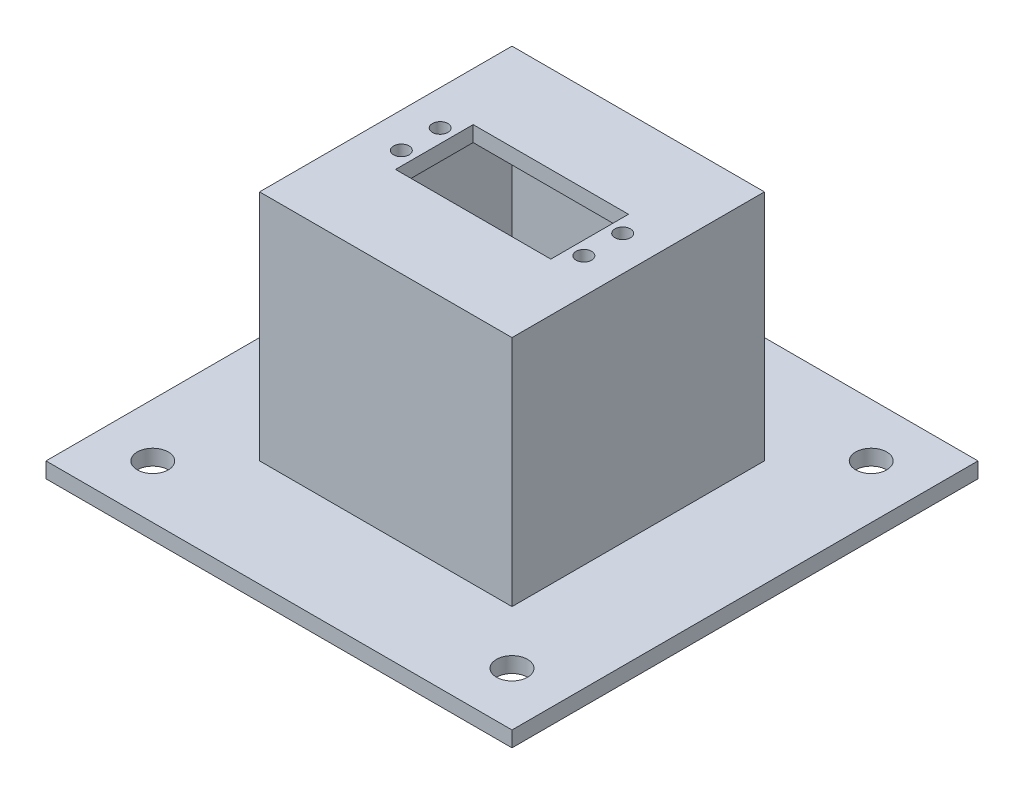
ISO-10303-21;
HEADER;
FILE_DESCRIPTION(('STEP AP214'),'2;1');
FILE_NAME('part.step','',(''),(''),'','','');
FILE_SCHEMA(('AUTOMOTIVE_DESIGN { 1 0 10303 214 1 1 1 1 }'));
ENDSEC;
DATA;
#1=APPLICATION_CONTEXT('core data for automotive mechanical design processes');
#2=APPLICATION_PROTOCOL_DEFINITION('international standard','automotive_design',2000,#1);
#3=PRODUCT_CONTEXT('',#1,'mechanical');
#4=PRODUCT('Part','Part','',(#3));
#5=PRODUCT_RELATED_PRODUCT_CATEGORY('part','',(#4));
#6=PRODUCT_DEFINITION_FORMATION('','',#4);
#7=PRODUCT_DEFINITION_CONTEXT('part definition',#1,'design');
#8=PRODUCT_DEFINITION('design','',#6,#7);
#9=PRODUCT_DEFINITION_SHAPE('','',#8);
#10=(LENGTH_UNIT() NAMED_UNIT(*) SI_UNIT(.MILLI.,.METRE.));
#11=(NAMED_UNIT(*) PLANE_ANGLE_UNIT() SI_UNIT($,.RADIAN.));
#12=(NAMED_UNIT(*) SI_UNIT($,.STERADIAN.) SOLID_ANGLE_UNIT());
#13=UNCERTAINTY_MEASURE_WITH_UNIT(LENGTH_MEASURE(1.E-05),#10,'distance_accuracy_value','');
#14=(GEOMETRIC_REPRESENTATION_CONTEXT(3) GLOBAL_UNCERTAINTY_ASSIGNED_CONTEXT((#13)) GLOBAL_UNIT_ASSIGNED_CONTEXT((#10,
#11,#12)) REPRESENTATION_CONTEXT('',''));
#15=CARTESIAN_POINT('',(0.,0.,0.));
#16=DIRECTION('',(0.,0.,1.));
#17=DIRECTION('',(1.,0.,0.));
#18=AXIS2_PLACEMENT_3D('',#15,#16,#17);
#19=CARTESIAN_POINT('',(0.,-4.,0.));
#20=DIRECTION('',(0.,-1.,0.));
#21=DIRECTION('',(0.,0.,-1.));
#22=AXIS2_PLACEMENT_3D('',#19,#20,#21);
#23=PLANE('',#22);
#24=CARTESIAN_POINT('',(-78.75,-4.,13.75));
#25=DIRECTION('',(0.,-1.,0.));
#26=DIRECTION('',(0.,0.,-1.));
#27=AXIS2_PLACEMENT_3D('',#24,#25,#26);
#28=CIRCLE('',#27,4.00000000000001);
#29=CARTESIAN_POINT('',(-78.75,-4.,9.75000000000002));
#30=VERTEX_POINT('',#29);
#31=EDGE_CURVE('E246',#30,#30,#28,.F.);
#32=ORIENTED_EDGE('',*,*,#31,.T.);
#33=EDGE_LOOP('',(#32));
#34=FACE_BOUND('',#33,.T.);
#35=CARTESIAN_POINT('',(13.75,-4.,13.75));
#36=DIRECTION('',(0.,-1.,0.));
#37=DIRECTION('',(0.,0.,-1.));
#38=AXIS2_PLACEMENT_3D('',#35,#36,#37);
#39=CIRCLE('',#38,4.00000000000001);
#40=CARTESIAN_POINT('',(13.75,-4.,9.75000000000002));
#41=VERTEX_POINT('',#40);
#42=EDGE_CURVE('E258',#41,#41,#39,.F.);
#43=ORIENTED_EDGE('',*,*,#42,.T.);
#44=EDGE_LOOP('',(#43));
#45=FACE_BOUND('',#44,.T.);
#46=CARTESIAN_POINT('',(13.75,-4.,-78.75));
#47=DIRECTION('',(0.,-1.,0.));
#48=DIRECTION('',(0.,0.,-1.));
#49=AXIS2_PLACEMENT_3D('',#46,#47,#48);
#50=CIRCLE('',#49,4.00000000000001);
#51=CARTESIAN_POINT('',(13.75,-4.,-82.75));
#52=VERTEX_POINT('',#51);
#53=EDGE_CURVE('E264',#52,#52,#50,.F.);
#54=ORIENTED_EDGE('',*,*,#53,.T.);
#55=EDGE_LOOP('',(#54));
#56=FACE_BOUND('',#55,.T.);
#57=CARTESIAN_POINT('',(-78.75,-4.,-78.75));
#58=DIRECTION('',(0.,-1.,0.));
#59=DIRECTION('',(0.,0.,-1.));
#60=AXIS2_PLACEMENT_3D('',#57,#58,#59);
#61=CIRCLE('',#60,4.00000000000001);
#62=CARTESIAN_POINT('',(-78.75,-4.,-82.75));
#63=VERTEX_POINT('',#62);
#64=EDGE_CURVE('E250',#63,#63,#61,.F.);
#65=ORIENTED_EDGE('',*,*,#64,.T.);
#66=EDGE_LOOP('',(#65));
#67=FACE_BOUND('',#66,.T.);
#68=DIRECTION('',(0.,0.,1.));
#69=VECTOR('',#68,1.);
#70=CARTESIAN_POINT('',(27.5,-4.,-92.5));
#71=LINE('',#70,#69);
#72=CARTESIAN_POINT('',(27.5,-4.,-92.5));
#73=VERTEX_POINT('',#72);
#74=CARTESIAN_POINT('',(27.5,-4.,27.5));
#75=VERTEX_POINT('',#74);
#76=EDGE_CURVE('E147',#73,#75,#71,.T.);
#77=ORIENTED_EDGE('',*,*,#76,.T.);
#78=DIRECTION('',(-1.,0.,0.));
#79=VECTOR('',#78,1.);
#80=CARTESIAN_POINT('',(27.5,-4.,27.5));
#81=LINE('',#80,#79);
#82=CARTESIAN_POINT('',(-92.5,-4.,27.5));
#83=VERTEX_POINT('',#82);
#84=EDGE_CURVE('E150',#75,#83,#81,.T.);
#85=ORIENTED_EDGE('',*,*,#84,.T.);
#86=DIRECTION('',(0.,0.,-1.));
#87=VECTOR('',#86,1.);
#88=CARTESIAN_POINT('',(-92.5,-4.,-92.5));
#89=LINE('',#88,#87);
#90=CARTESIAN_POINT('',(-92.5,-4.,-92.5));
#91=VERTEX_POINT('',#90);
#92=EDGE_CURVE('E153',#83,#91,#89,.T.);
#93=ORIENTED_EDGE('',*,*,#92,.T.);
#94=DIRECTION('',(1.,0.,0.));
#95=VECTOR('',#94,1.);
#96=CARTESIAN_POINT('',(27.5,-4.,-92.5));
#97=LINE('',#96,#95);
#98=EDGE_CURVE('E155',#91,#73,#97,.T.);
#99=ORIENTED_EDGE('',*,*,#98,.T.);
#100=EDGE_LOOP('',(#77,#85,#93,#99));
#101=FACE_BOUND('',#100,.T.);
#102=DIRECTION('',(-1.,0.,0.));
#103=VECTOR('',#102,1.);
#104=CARTESIAN_POINT('',(0.,-4.,0.));
#105=LINE('',#104,#103);
#106=CARTESIAN_POINT('',(0.,-4.,0.));
#107=VERTEX_POINT('',#106);
#108=CARTESIAN_POINT('',(-65.,-4.,0.));
#109=VERTEX_POINT('',#108);
#110=EDGE_CURVE('E117',#107,#109,#105,.T.);
#111=ORIENTED_EDGE('',*,*,#110,.F.);
#112=DIRECTION('',(0.,0.,1.));
#113=VECTOR('',#112,1.);
#114=CARTESIAN_POINT('',(0.,-4.,-65.));
#115=LINE('',#114,#113);
#116=CARTESIAN_POINT('',(0.,-4.,-65.));
#117=VERTEX_POINT('',#116);
#118=EDGE_CURVE('E109',#117,#107,#115,.T.);
#119=ORIENTED_EDGE('',*,*,#118,.F.);
#120=DIRECTION('',(1.,0.,0.));
#121=VECTOR('',#120,1.);
#122=CARTESIAN_POINT('',(0.,-4.,-65.));
#123=LINE('',#122,#121);
#124=CARTESIAN_POINT('',(-65.,-4.,-65.));
#125=VERTEX_POINT('',#124);
#126=EDGE_CURVE('E131',#125,#117,#123,.T.);
#127=ORIENTED_EDGE('',*,*,#126,.F.);
#128=DIRECTION('',(0.,0.,-1.));
#129=VECTOR('',#128,1.);
#130=CARTESIAN_POINT('',(-65.,-4.,-65.));
#131=LINE('',#130,#129);
#132=EDGE_CURVE('E129',#109,#125,#131,.T.);
#133=ORIENTED_EDGE('',*,*,#132,.F.);
#134=EDGE_LOOP('',(#111,#119,#127,#133));
#135=FACE_BOUND('',#134,.T.);
#136=ADVANCED_FACE('F44',(#34,#45,#56,#67,#101,#135),#23,.T.);
#137=CARTESIAN_POINT('',(0.,0.,0.));
#138=DIRECTION('',(0.,-1.,0.));
#139=DIRECTION('',(0.,0.,-1.));
#140=AXIS2_PLACEMENT_3D('',#137,#138,#139);
#141=PLANE('',#140);
#142=CARTESIAN_POINT('',(-78.75,0.,13.75));
#143=DIRECTION('',(0.,1.,0.));
#144=DIRECTION('',(0.,0.,-1.));
#145=AXIS2_PLACEMENT_3D('',#142,#143,#144);
#146=CIRCLE('',#145,4.00000000000001);
#147=CARTESIAN_POINT('',(-78.75,0.,9.75000000000002));
#148=VERTEX_POINT('',#147);
#149=EDGE_CURVE('E249',#148,#148,#146,.T.);
#150=ORIENTED_EDGE('',*,*,#149,.F.);
#151=EDGE_LOOP('',(#150));
#152=FACE_BOUND('',#151,.T.);
#153=CARTESIAN_POINT('',(13.75,0.,13.75));
#154=DIRECTION('',(0.,1.,0.));
#155=DIRECTION('',(0.,0.,1.));
#156=AXIS2_PLACEMENT_3D('',#153,#154,#155);
#157=CIRCLE('',#156,4.00000000000001);
#158=CARTESIAN_POINT('',(13.75,0.,17.75));
#159=VERTEX_POINT('',#158);
#160=EDGE_CURVE('E253',#159,#159,#157,.T.);
#161=ORIENTED_EDGE('',*,*,#160,.F.);
#162=EDGE_LOOP('',(#161));
#163=FACE_BOUND('',#162,.T.);
#164=CARTESIAN_POINT('',(13.75,0.,-78.75));
#165=DIRECTION('',(0.,1.,0.));
#166=DIRECTION('',(0.,0.,-1.));
#167=AXIS2_PLACEMENT_3D('',#164,#165,#166);
#168=CIRCLE('',#167,4.00000000000001);
#169=CARTESIAN_POINT('',(13.75,0.,-82.75));
#170=VERTEX_POINT('',#169);
#171=EDGE_CURVE('E261',#170,#170,#168,.T.);
#172=ORIENTED_EDGE('',*,*,#171,.F.);
#173=EDGE_LOOP('',(#172));
#174=FACE_BOUND('',#173,.T.);
#175=CARTESIAN_POINT('',(-78.75,0.,-78.75));
#176=DIRECTION('',(0.,1.,0.));
#177=DIRECTION('',(0.,0.,1.));
#178=AXIS2_PLACEMENT_3D('',#175,#176,#177);
#179=CIRCLE('',#178,4.00000000000001);
#180=CARTESIAN_POINT('',(-78.75,0.,-74.75));
#181=VERTEX_POINT('',#180);
#182=EDGE_CURVE('E137',#181,#181,#179,.T.);
#183=ORIENTED_EDGE('',*,*,#182,.F.);
#184=EDGE_LOOP('',(#183));
#185=FACE_BOUND('',#184,.T.);
#186=DIRECTION('',(0.,0.,1.));
#187=VECTOR('',#186,1.);
#188=CARTESIAN_POINT('',(27.5,0.,-92.5));
#189=LINE('',#188,#187);
#190=CARTESIAN_POINT('',(27.5,0.,-92.5));
#191=VERTEX_POINT('',#190);
#192=CARTESIAN_POINT('',(27.5,0.,27.5));
#193=VERTEX_POINT('',#192);
#194=EDGE_CURVE('E125',#191,#193,#189,.T.);
#195=ORIENTED_EDGE('',*,*,#194,.F.);
#196=DIRECTION('',(1.,0.,0.));
#197=VECTOR('',#196,1.);
#198=CARTESIAN_POINT('',(27.5,0.,-92.5));
#199=LINE('',#198,#197);
#200=CARTESIAN_POINT('',(-92.5,0.,-92.5));
#201=VERTEX_POINT('',#200);
#202=EDGE_CURVE('E151',#201,#191,#199,.T.);
#203=ORIENTED_EDGE('',*,*,#202,.F.);
#204=DIRECTION('',(0.,0.,-1.));
#205=VECTOR('',#204,1.);
#206=CARTESIAN_POINT('',(-92.5,0.,-92.5));
#207=LINE('',#206,#205);
#208=CARTESIAN_POINT('',(-92.5,0.,27.5));
#209=VERTEX_POINT('',#208);
#210=EDGE_CURVE('E162',#209,#201,#207,.T.);
#211=ORIENTED_EDGE('',*,*,#210,.F.);
#212=DIRECTION('',(-1.,0.,0.));
#213=VECTOR('',#212,1.);
#214=CARTESIAN_POINT('',(27.5,0.,27.5));
#215=LINE('',#214,#213);
#216=EDGE_CURVE('E160',#193,#209,#215,.T.);
#217=ORIENTED_EDGE('',*,*,#216,.F.);
#218=EDGE_LOOP('',(#195,#203,#211,#217));
#219=FACE_BOUND('',#218,.T.);
#220=DIRECTION('',(0.,0.,1.));
#221=VECTOR('',#220,1.);
#222=CARTESIAN_POINT('',(0.,0.,-65.));
#223=LINE('',#222,#221);
#224=CARTESIAN_POINT('',(0.,0.,-65.));
#225=VERTEX_POINT('',#224);
#226=CARTESIAN_POINT('',(0.,0.,0.));
#227=VERTEX_POINT('',#226);
#228=EDGE_CURVE('E67',#225,#227,#223,.T.);
#229=ORIENTED_EDGE('',*,*,#228,.T.);
#230=DIRECTION('',(-1.,0.,0.));
#231=VECTOR('',#230,1.);
#232=CARTESIAN_POINT('',(0.,0.,0.));
#233=LINE('',#232,#231);
#234=CARTESIAN_POINT('',(-65.,0.,0.));
#235=VERTEX_POINT('',#234);
#236=EDGE_CURVE('E124',#227,#235,#233,.T.);
#237=ORIENTED_EDGE('',*,*,#236,.T.);
#238=DIRECTION('',(0.,0.,-1.));
#239=VECTOR('',#238,1.);
#240=CARTESIAN_POINT('',(-65.,0.,-65.));
#241=LINE('',#240,#239);
#242=CARTESIAN_POINT('',(-65.,0.,-65.));
#243=VERTEX_POINT('',#242);
#244=EDGE_CURVE('E139',#235,#243,#241,.T.);
#245=ORIENTED_EDGE('',*,*,#244,.T.);
#246=DIRECTION('',(1.,0.,0.));
#247=VECTOR('',#246,1.);
#248=CARTESIAN_POINT('',(0.,0.,-65.));
#249=LINE('',#248,#247);
#250=EDGE_CURVE('E118',#243,#225,#249,.T.);
#251=ORIENTED_EDGE('',*,*,#250,.T.);
#252=EDGE_LOOP('',(#229,#237,#245,#251));
#253=FACE_BOUND('',#252,.T.);
#254=ADVANCED_FACE('F180',(#152,#163,#174,#185,#219,#253),#141,.F.);
#255=CARTESIAN_POINT('',(27.5,-4.,-92.5));
#256=DIRECTION('',(-1.,0.,0.));
#257=DIRECTION('',(0.,0.,1.));
#258=AXIS2_PLACEMENT_3D('',#255,#256,#257);
#259=PLANE('',#258);
#260=ORIENTED_EDGE('',*,*,#194,.T.);
#261=DIRECTION('',(0.,1.,0.));
#262=VECTOR('',#261,1.);
#263=CARTESIAN_POINT('',(27.5,-4.,27.5));
#264=LINE('',#263,#262);
#265=EDGE_CURVE('E12',#75,#193,#264,.T.);
#266=ORIENTED_EDGE('',*,*,#265,.F.);
#267=ORIENTED_EDGE('',*,*,#76,.F.);
#268=DIRECTION('',(0.,1.,0.));
#269=VECTOR('',#268,1.);
#270=CARTESIAN_POINT('',(27.5,-4.,-92.5));
#271=LINE('',#270,#269);
#272=EDGE_CURVE('E157',#73,#191,#271,.T.);
#273=ORIENTED_EDGE('',*,*,#272,.T.);
#274=EDGE_LOOP('',(#260,#266,#267,#273));
#275=FACE_BOUND('',#274,.T.);
#276=ADVANCED_FACE('F46',(#275),#259,.F.);
#277=CARTESIAN_POINT('',(27.5,-4.,27.5));
#278=DIRECTION('',(0.,0.,-1.));
#279=DIRECTION('',(-1.,0.,0.));
#280=AXIS2_PLACEMENT_3D('',#277,#278,#279);
#281=PLANE('',#280);
#282=ORIENTED_EDGE('',*,*,#216,.T.);
#283=DIRECTION('',(0.,1.,0.));
#284=VECTOR('',#283,1.);
#285=CARTESIAN_POINT('',(-92.5,-4.,27.5));
#286=LINE('',#285,#284);
#287=EDGE_CURVE('E52',#83,#209,#286,.T.);
#288=ORIENTED_EDGE('',*,*,#287,.F.);
#289=ORIENTED_EDGE('',*,*,#84,.F.);
#290=ORIENTED_EDGE('',*,*,#265,.T.);
#291=EDGE_LOOP('',(#282,#288,#289,#290));
#292=FACE_BOUND('',#291,.T.);
#293=ADVANCED_FACE('F190',(#292),#281,.F.);
#294=CARTESIAN_POINT('',(-92.5,-4.,-92.5));
#295=DIRECTION('',(1.,0.,0.));
#296=DIRECTION('',(0.,0.,-1.));
#297=AXIS2_PLACEMENT_3D('',#294,#295,#296);
#298=PLANE('',#297);
#299=ORIENTED_EDGE('',*,*,#210,.T.);
#300=DIRECTION('',(0.,1.,0.));
#301=VECTOR('',#300,1.);
#302=CARTESIAN_POINT('',(-92.5,-4.,-92.5));
#303=LINE('',#302,#301);
#304=EDGE_CURVE('E167',#91,#201,#303,.T.);
#305=ORIENTED_EDGE('',*,*,#304,.F.);
#306=ORIENTED_EDGE('',*,*,#92,.F.);
#307=ORIENTED_EDGE('',*,*,#287,.T.);
#308=EDGE_LOOP('',(#299,#305,#306,#307));
#309=FACE_BOUND('',#308,.T.);
#310=ADVANCED_FACE('F174',(#309),#298,.F.);
#311=CARTESIAN_POINT('',(27.5,-4.,-92.5));
#312=DIRECTION('',(0.,0.,1.));
#313=DIRECTION('',(1.,0.,0.));
#314=AXIS2_PLACEMENT_3D('',#311,#312,#313);
#315=PLANE('',#314);
#316=ORIENTED_EDGE('',*,*,#202,.T.);
#317=ORIENTED_EDGE('',*,*,#272,.F.);
#318=ORIENTED_EDGE('',*,*,#98,.F.);
#319=ORIENTED_EDGE('',*,*,#304,.T.);
#320=EDGE_LOOP('',(#316,#317,#318,#319));
#321=FACE_BOUND('',#320,.T.);
#322=ADVANCED_FACE('F184',(#321),#315,.F.);
#323=CARTESIAN_POINT('',(0.,-4.,-65.));
#324=DIRECTION('',(-1.,0.,0.));
#325=DIRECTION('',(0.,0.,1.));
#326=AXIS2_PLACEMENT_3D('',#323,#324,#325);
#327=PLANE('',#326);
#328=ORIENTED_EDGE('',*,*,#228,.F.);
#329=DIRECTION('',(0.,1.,0.));
#330=VECTOR('',#329,1.);
#331=CARTESIAN_POINT('',(0.,-4.,-65.));
#332=LINE('',#331,#330);
#333=EDGE_CURVE('E113',#117,#225,#332,.T.);
#334=ORIENTED_EDGE('',*,*,#333,.F.);
#335=ORIENTED_EDGE('',*,*,#118,.T.);
#336=DIRECTION('',(0.,1.,0.));
#337=VECTOR('',#336,1.);
#338=CARTESIAN_POINT('',(0.,-4.,0.));
#339=LINE('',#338,#337);
#340=EDGE_CURVE('E112',#107,#227,#339,.T.);
#341=ORIENTED_EDGE('',*,*,#340,.T.);
#342=EDGE_LOOP('',(#328,#334,#335,#341));
#343=FACE_BOUND('',#342,.T.);
#344=ADVANCED_FACE('F111',(#343),#327,.T.);
#345=CARTESIAN_POINT('',(0.,-4.,0.));
#346=DIRECTION('',(0.,0.,-1.));
#347=DIRECTION('',(-1.,0.,0.));
#348=AXIS2_PLACEMENT_3D('',#345,#346,#347);
#349=PLANE('',#348);
#350=ORIENTED_EDGE('',*,*,#236,.F.);
#351=ORIENTED_EDGE('',*,*,#340,.F.);
#352=ORIENTED_EDGE('',*,*,#110,.T.);
#353=DIRECTION('',(0.,1.,0.));
#354=VECTOR('',#353,1.);
#355=CARTESIAN_POINT('',(-65.,-4.,0.));
#356=LINE('',#355,#354);
#357=EDGE_CURVE('E126',#109,#235,#356,.T.);
#358=ORIENTED_EDGE('',*,*,#357,.T.);
#359=EDGE_LOOP('',(#350,#351,#352,#358));
#360=FACE_BOUND('',#359,.T.);
#361=ADVANCED_FACE('F121',(#360),#349,.T.);
#362=CARTESIAN_POINT('',(-65.,-4.,-65.));
#363=DIRECTION('',(1.,0.,0.));
#364=DIRECTION('',(0.,0.,-1.));
#365=AXIS2_PLACEMENT_3D('',#362,#363,#364);
#366=PLANE('',#365);
#367=ORIENTED_EDGE('',*,*,#244,.F.);
#368=ORIENTED_EDGE('',*,*,#357,.F.);
#369=ORIENTED_EDGE('',*,*,#132,.T.);
#370=DIRECTION('',(0.,1.,0.));
#371=VECTOR('',#370,1.);
#372=CARTESIAN_POINT('',(-65.,-4.,-65.));
#373=LINE('',#372,#371);
#374=EDGE_CURVE('E59',#125,#243,#373,.T.);
#375=ORIENTED_EDGE('',*,*,#374,.T.);
#376=EDGE_LOOP('',(#367,#368,#369,#375));
#377=FACE_BOUND('',#376,.T.);
#378=ADVANCED_FACE('F217',(#377),#366,.T.);
#379=CARTESIAN_POINT('',(0.,-4.,-65.));
#380=DIRECTION('',(0.,0.,1.));
#381=DIRECTION('',(1.,0.,0.));
#382=AXIS2_PLACEMENT_3D('',#379,#380,#381);
#383=PLANE('',#382);
#384=ORIENTED_EDGE('',*,*,#250,.F.);
#385=ORIENTED_EDGE('',*,*,#374,.F.);
#386=ORIENTED_EDGE('',*,*,#126,.T.);
#387=ORIENTED_EDGE('',*,*,#333,.T.);
#388=EDGE_LOOP('',(#384,#385,#386,#387));
#389=FACE_BOUND('',#388,.T.);
#390=ADVANCED_FACE('F221',(#389),#383,.T.);
#391=CARTESIAN_POINT('',(-78.75,-4.001,-78.75));
#392=DIRECTION('',(0.,1.,0.));
#393=DIRECTION('',(0.,0.,1.));
#394=AXIS2_PLACEMENT_3D('',#391,#392,#393);
#395=CYLINDRICAL_SURFACE('',#394,4.00000000000001);
#396=ORIENTED_EDGE('',*,*,#64,.F.);
#397=EDGE_LOOP('',(#396));
#398=FACE_BOUND('',#397,.T.);
#399=ORIENTED_EDGE('',*,*,#182,.T.);
#400=EDGE_LOOP('',(#399));
#401=FACE_BOUND('',#400,.T.);
#402=ADVANCED_FACE('F227',(#398,#401),#395,.F.);
#403=CARTESIAN_POINT('',(13.75,-4.001,-78.75));
#404=DIRECTION('',(0.,1.,0.));
#405=DIRECTION('',(0.,0.,1.));
#406=AXIS2_PLACEMENT_3D('',#403,#404,#405);
#407=CYLINDRICAL_SURFACE('',#406,4.00000000000001);
#408=ORIENTED_EDGE('',*,*,#53,.F.);
#409=EDGE_LOOP('',(#408));
#410=FACE_BOUND('',#409,.T.);
#411=ORIENTED_EDGE('',*,*,#171,.T.);
#412=EDGE_LOOP('',(#411));
#413=FACE_BOUND('',#412,.T.);
#414=ADVANCED_FACE('F230',(#410,#413),#407,.F.);
#415=CARTESIAN_POINT('',(13.75,-4.001,13.75));
#416=DIRECTION('',(0.,1.,0.));
#417=DIRECTION('',(0.,0.,1.));
#418=AXIS2_PLACEMENT_3D('',#415,#416,#417);
#419=CYLINDRICAL_SURFACE('',#418,4.00000000000001);
#420=ORIENTED_EDGE('',*,*,#42,.F.);
#421=EDGE_LOOP('',(#420));
#422=FACE_BOUND('',#421,.T.);
#423=ORIENTED_EDGE('',*,*,#160,.T.);
#424=EDGE_LOOP('',(#423));
#425=FACE_BOUND('',#424,.T.);
#426=ADVANCED_FACE('F234',(#422,#425),#419,.F.);
#427=CARTESIAN_POINT('',(-78.75,-4.001,13.75));
#428=DIRECTION('',(0.,1.,0.));
#429=DIRECTION('',(0.,0.,1.));
#430=AXIS2_PLACEMENT_3D('',#427,#428,#429);
#431=CYLINDRICAL_SURFACE('',#430,4.00000000000001);
#432=ORIENTED_EDGE('',*,*,#31,.F.);
#433=EDGE_LOOP('',(#432));
#434=FACE_BOUND('',#433,.T.);
#435=ORIENTED_EDGE('',*,*,#149,.T.);
#436=EDGE_LOOP('',(#435));
#437=FACE_BOUND('',#436,.T.);
#438=ADVANCED_FACE('F238',(#434,#437),#431,.F.);
#439=CLOSED_SHELL('',(#136,#254,#276,#293,#310,#322,#344,#361,#378,#390,#402,#414,#426,#438));
#440=MANIFOLD_SOLID_BREP('B2',#439);
#441=CARTESIAN_POINT('',(0.,60.,0.));
#442=DIRECTION('',(-1.,0.,0.));
#443=DIRECTION('',(0.,0.,1.));
#444=AXIS2_PLACEMENT_3D('',#441,#442,#443);
#445=PLANE('',#444);
#446=DIRECTION('',(0.,0.,-1.));
#447=VECTOR('',#446,1.);
#448=CARTESIAN_POINT('',(0.,0.,0.));
#449=LINE('',#448,#447);
#450=CARTESIAN_POINT('',(0.,0.,0.));
#451=VERTEX_POINT('',#450);
#452=CARTESIAN_POINT('',(0.,0.,-65.));
#453=VERTEX_POINT('',#452);
#454=EDGE_CURVE('E485',#451,#453,#449,.T.);
#455=ORIENTED_EDGE('',*,*,#454,.T.);
#456=DIRECTION('',(0.,-1.,0.));
#457=VECTOR('',#456,1.);
#458=CARTESIAN_POINT('',(0.,60.,-65.));
#459=LINE('',#458,#457);
#460=CARTESIAN_POINT('',(0.,60.,-65.));
#461=VERTEX_POINT('',#460);
#462=EDGE_CURVE('E42',#461,#453,#459,.T.);
#463=ORIENTED_EDGE('',*,*,#462,.F.);
#464=DIRECTION('',(0.,0.,-1.));
#465=VECTOR('',#464,1.);
#466=CARTESIAN_POINT('',(0.,60.,0.));
#467=LINE('',#466,#465);
#468=CARTESIAN_POINT('',(0.,60.,0.));
#469=VERTEX_POINT('',#468);
#470=EDGE_CURVE('E513',#469,#461,#467,.T.);
#471=ORIENTED_EDGE('',*,*,#470,.F.);
#472=DIRECTION('',(0.,-1.,0.));
#473=VECTOR('',#472,1.);
#474=CARTESIAN_POINT('',(0.,60.,0.));
#475=LINE('',#474,#473);
#476=EDGE_CURVE('E523',#469,#451,#475,.T.);
#477=ORIENTED_EDGE('',*,*,#476,.T.);
#478=EDGE_LOOP('',(#455,#463,#471,#477));
#479=FACE_BOUND('',#478,.T.);
#480=ADVANCED_FACE('F357',(#479),#445,.F.);
#481=CARTESIAN_POINT('',(0.,60.,-65.));
#482=DIRECTION('',(0.,0.,1.));
#483=DIRECTION('',(1.,0.,0.));
#484=AXIS2_PLACEMENT_3D('',#481,#482,#483);
#485=PLANE('',#484);
#486=DIRECTION('',(-1.,0.,0.));
#487=VECTOR('',#486,1.);
#488=CARTESIAN_POINT('',(0.,0.,-65.));
#489=LINE('',#488,#487);
#490=CARTESIAN_POINT('',(-65.,0.,-65.));
#491=VERTEX_POINT('',#490);
#492=EDGE_CURVE('E526',#453,#491,#489,.T.);
#493=ORIENTED_EDGE('',*,*,#492,.T.);
#494=DIRECTION('',(0.,-1.,0.));
#495=VECTOR('',#494,1.);
#496=CARTESIAN_POINT('',(-65.,60.,-65.));
#497=LINE('',#496,#495);
#498=CARTESIAN_POINT('',(-65.,60.,-65.));
#499=VERTEX_POINT('',#498);
#500=EDGE_CURVE('E364',#499,#491,#497,.T.);
#501=ORIENTED_EDGE('',*,*,#500,.F.);
#502=DIRECTION('',(-1.,0.,0.));
#503=VECTOR('',#502,1.);
#504=CARTESIAN_POINT('',(0.,60.,-65.));
#505=LINE('',#504,#503);
#506=EDGE_CURVE('E516',#461,#499,#505,.T.);
#507=ORIENTED_EDGE('',*,*,#506,.F.);
#508=ORIENTED_EDGE('',*,*,#462,.T.);
#509=EDGE_LOOP('',(#493,#501,#507,#508));
#510=FACE_BOUND('',#509,.T.);
#511=ADVANCED_FACE('F556',(#510),#485,.F.);
#512=CARTESIAN_POINT('',(-65.,60.,0.));
#513=DIRECTION('',(1.,0.,0.));
#514=DIRECTION('',(0.,0.,-1.));
#515=AXIS2_PLACEMENT_3D('',#512,#513,#514);
#516=PLANE('',#515);
#517=DIRECTION('',(0.,0.,1.));
#518=VECTOR('',#517,1.);
#519=CARTESIAN_POINT('',(-65.,0.,0.));
#520=LINE('',#519,#518);
#521=CARTESIAN_POINT('',(-65.,0.,0.));
#522=VERTEX_POINT('',#521);
#523=EDGE_CURVE('E528',#491,#522,#520,.T.);
#524=ORIENTED_EDGE('',*,*,#523,.T.);
#525=DIRECTION('',(0.,-1.,0.));
#526=VECTOR('',#525,1.);
#527=CARTESIAN_POINT('',(-65.,60.,0.));
#528=LINE('',#527,#526);
#529=CARTESIAN_POINT('',(-65.,60.,0.));
#530=VERTEX_POINT('',#529);
#531=EDGE_CURVE('E533',#530,#522,#528,.T.);
#532=ORIENTED_EDGE('',*,*,#531,.F.);
#533=DIRECTION('',(0.,0.,1.));
#534=VECTOR('',#533,1.);
#535=CARTESIAN_POINT('',(-65.,60.,0.));
#536=LINE('',#535,#534);
#537=EDGE_CURVE('E519',#499,#530,#536,.T.);
#538=ORIENTED_EDGE('',*,*,#537,.F.);
#539=ORIENTED_EDGE('',*,*,#500,.T.);
#540=EDGE_LOOP('',(#524,#532,#538,#539));
#541=FACE_BOUND('',#540,.T.);
#542=ADVANCED_FACE('F540',(#541),#516,.F.);
#543=CARTESIAN_POINT('',(0.,60.,0.));
#544=DIRECTION('',(0.,0.,-1.));
#545=DIRECTION('',(-1.,0.,0.));
#546=AXIS2_PLACEMENT_3D('',#543,#544,#545);
#547=PLANE('',#546);
#548=DIRECTION('',(1.,0.,0.));
#549=VECTOR('',#548,1.);
#550=CARTESIAN_POINT('',(0.,0.,0.));
#551=LINE('',#550,#549);
#552=EDGE_CURVE('E517',#522,#451,#551,.T.);
#553=ORIENTED_EDGE('',*,*,#552,.T.);
#554=ORIENTED_EDGE('',*,*,#476,.F.);
#555=DIRECTION('',(1.,0.,0.));
#556=VECTOR('',#555,1.);
#557=CARTESIAN_POINT('',(0.,60.,0.));
#558=LINE('',#557,#556);
#559=EDGE_CURVE('E521',#530,#469,#558,.T.);
#560=ORIENTED_EDGE('',*,*,#559,.F.);
#561=ORIENTED_EDGE('',*,*,#531,.T.);
#562=EDGE_LOOP('',(#553,#554,#560,#561));
#563=FACE_BOUND('',#562,.T.);
#564=ADVANCED_FACE('F549',(#563),#547,.F.);
#565=CARTESIAN_POINT('',(0.,60.,0.));
#566=DIRECTION('',(0.,1.,0.));
#567=DIRECTION('',(0.,0.,1.));
#568=AXIS2_PLACEMENT_3D('',#565,#566,#567);
#569=PLANE('',#568);
#570=CARTESIAN_POINT('',(-56.,60.,-37.5));
#571=DIRECTION('',(0.,1.,0.));
#572=DIRECTION('',(0.,0.,1.));
#573=AXIS2_PLACEMENT_3D('',#570,#571,#572);
#574=CIRCLE('',#573,2.);
#575=CARTESIAN_POINT('',(-56.,60.,-35.5));
#576=VERTEX_POINT('',#575);
#577=EDGE_CURVE('E622',#576,#576,#574,.T.);
#578=ORIENTED_EDGE('',*,*,#577,.F.);
#579=EDGE_LOOP('',(#578));
#580=FACE_BOUND('',#579,.T.);
#581=CARTESIAN_POINT('',(-56.,60.,-27.5));
#582=DIRECTION('',(0.,1.,0.));
#583=DIRECTION('',(0.,0.,-1.));
#584=AXIS2_PLACEMENT_3D('',#581,#582,#583);
#585=CIRCLE('',#584,2.);
#586=CARTESIAN_POINT('',(-56.,60.,-29.5));
#587=VERTEX_POINT('',#586);
#588=EDGE_CURVE('E630',#587,#587,#585,.T.);
#589=ORIENTED_EDGE('',*,*,#588,.F.);
#590=EDGE_LOOP('',(#589));
#591=FACE_BOUND('',#590,.T.);
#592=CARTESIAN_POINT('',(-9.00000000000001,60.,-27.5));
#593=DIRECTION('',(0.,1.,0.));
#594=DIRECTION('',(0.,0.,1.));
#595=AXIS2_PLACEMENT_3D('',#592,#593,#594);
#596=CIRCLE('',#595,2.);
#597=CARTESIAN_POINT('',(-9.00000000000001,60.,-25.5));
#598=VERTEX_POINT('',#597);
#599=EDGE_CURVE('E636',#598,#598,#596,.T.);
#600=ORIENTED_EDGE('',*,*,#599,.F.);
#601=EDGE_LOOP('',(#600));
#602=FACE_BOUND('',#601,.T.);
#603=CARTESIAN_POINT('',(-9.00000000000001,60.,-37.5));
#604=DIRECTION('',(0.,1.,0.));
#605=DIRECTION('',(0.,0.,-1.));
#606=AXIS2_PLACEMENT_3D('',#603,#604,#605);
#607=CIRCLE('',#606,2.);
#608=CARTESIAN_POINT('',(-9.00000000000001,60.,-39.5));
#609=VERTEX_POINT('',#608);
#610=EDGE_CURVE('E642',#609,#609,#607,.T.);
#611=ORIENTED_EDGE('',*,*,#610,.F.);
#612=EDGE_LOOP('',(#611));
#613=FACE_BOUND('',#612,.T.);
#614=DIRECTION('',(0.,0.,-1.));
#615=VECTOR('',#614,1.);
#616=CARTESIAN_POINT('',(-12.5,60.,-22.5));
#617=LINE('',#616,#615);
#618=CARTESIAN_POINT('',(-12.5,60.,-22.5));
#619=VERTEX_POINT('',#618);
#620=CARTESIAN_POINT('',(-12.5,60.,-42.5));
#621=VERTEX_POINT('',#620);
#622=EDGE_CURVE('E371',#619,#621,#617,.T.);
#623=ORIENTED_EDGE('',*,*,#622,.F.);
#624=DIRECTION('',(1.,0.,0.));
#625=VECTOR('',#624,1.);
#626=CARTESIAN_POINT('',(-12.5,60.,-22.5));
#627=LINE('',#626,#625);
#628=CARTESIAN_POINT('',(-52.5,60.,-22.5));
#629=VERTEX_POINT('',#628);
#630=EDGE_CURVE('E453',#629,#619,#627,.T.);
#631=ORIENTED_EDGE('',*,*,#630,.F.);
#632=DIRECTION('',(0.,0.,1.));
#633=VECTOR('',#632,1.);
#634=CARTESIAN_POINT('',(-52.5,60.,-22.5));
#635=LINE('',#634,#633);
#636=CARTESIAN_POINT('',(-52.5,60.,-42.5));
#637=VERTEX_POINT('',#636);
#638=EDGE_CURVE('E473',#637,#629,#635,.T.);
#639=ORIENTED_EDGE('',*,*,#638,.F.);
#640=DIRECTION('',(-1.,0.,0.));
#641=VECTOR('',#640,1.);
#642=CARTESIAN_POINT('',(-12.5,60.,-42.5));
#643=LINE('',#642,#641);
#644=EDGE_CURVE('E467',#621,#637,#643,.T.);
#645=ORIENTED_EDGE('',*,*,#644,.F.);
#646=EDGE_LOOP('',(#623,#631,#639,#645));
#647=FACE_BOUND('',#646,.T.);
#648=ORIENTED_EDGE('',*,*,#470,.T.);
#649=ORIENTED_EDGE('',*,*,#506,.T.);
#650=ORIENTED_EDGE('',*,*,#537,.T.);
#651=ORIENTED_EDGE('',*,*,#559,.T.);
#652=EDGE_LOOP('',(#648,#649,#650,#651));
#653=FACE_BOUND('',#652,.T.);
#654=ADVANCED_FACE('F555',(#580,#591,#602,#613,#647,#653),#569,.T.);
#655=CARTESIAN_POINT('',(0.,0.,0.));
#656=DIRECTION('',(0.,1.,0.));
#657=DIRECTION('',(0.,0.,1.));
#658=AXIS2_PLACEMENT_3D('',#655,#656,#657);
#659=PLANE('',#658);
#660=DIRECTION('',(1.,0.,0.));
#661=VECTOR('',#660,1.);
#662=CARTESIAN_POINT('',(0.,0.,-4.));
#663=LINE('',#662,#661);
#664=CARTESIAN_POINT('',(-61.,0.,-3.99999999999999));
#665=VERTEX_POINT('',#664);
#666=CARTESIAN_POINT('',(-4.,0.,-4.));
#667=VERTEX_POINT('',#666);
#668=EDGE_CURVE('E491',#665,#667,#663,.T.);
#669=ORIENTED_EDGE('',*,*,#668,.T.);
#670=DIRECTION('',(0.,0.,-1.));
#671=VECTOR('',#670,1.);
#672=CARTESIAN_POINT('',(-4.,0.,0.));
#673=LINE('',#672,#671);
#674=CARTESIAN_POINT('',(-4.,0.,-61.));
#675=VERTEX_POINT('',#674);
#676=EDGE_CURVE('E459',#667,#675,#673,.T.);
#677=ORIENTED_EDGE('',*,*,#676,.T.);
#678=DIRECTION('',(-1.,0.,0.));
#679=VECTOR('',#678,1.);
#680=CARTESIAN_POINT('',(0.,0.,-61.));
#681=LINE('',#680,#679);
#682=CARTESIAN_POINT('',(-61.,0.,-61.));
#683=VERTEX_POINT('',#682);
#684=EDGE_CURVE('E505',#675,#683,#681,.T.);
#685=ORIENTED_EDGE('',*,*,#684,.T.);
#686=DIRECTION('',(0.,0.,1.));
#687=VECTOR('',#686,1.);
#688=CARTESIAN_POINT('',(-61.,0.,0.));
#689=LINE('',#688,#687);
#690=EDGE_CURVE('E508',#683,#665,#689,.T.);
#691=ORIENTED_EDGE('',*,*,#690,.T.);
#692=EDGE_LOOP('',(#669,#677,#685,#691));
#693=FACE_BOUND('',#692,.T.);
#694=ORIENTED_EDGE('',*,*,#454,.F.);
#695=ORIENTED_EDGE('',*,*,#552,.F.);
#696=ORIENTED_EDGE('',*,*,#523,.F.);
#697=ORIENTED_EDGE('',*,*,#492,.F.);
#698=EDGE_LOOP('',(#694,#695,#696,#697));
#699=FACE_BOUND('',#698,.T.);
#700=ADVANCED_FACE('F546',(#693,#699),#659,.F.);
#701=CARTESIAN_POINT('',(-4.,60.,0.));
#702=DIRECTION('',(-1.,0.,0.));
#703=DIRECTION('',(0.,0.,1.));
#704=AXIS2_PLACEMENT_3D('',#701,#702,#703);
#705=PLANE('',#704);
#706=ORIENTED_EDGE('',*,*,#676,.F.);
#707=DIRECTION('',(0.,-1.,0.));
#708=VECTOR('',#707,1.);
#709=CARTESIAN_POINT('',(-4.,60.,-4.));
#710=LINE('',#709,#708);
#711=CARTESIAN_POINT('',(-4.,56.,-4.));
#712=VERTEX_POINT('',#711);
#713=EDGE_CURVE('E492',#712,#667,#710,.T.);
#714=ORIENTED_EDGE('',*,*,#713,.F.);
#715=DIRECTION('',(0.,0.,-1.));
#716=VECTOR('',#715,1.);
#717=CARTESIAN_POINT('',(-4.,56.,0.));
#718=LINE('',#717,#716);
#719=CARTESIAN_POINT('',(-4.,56.,-61.));
#720=VERTEX_POINT('',#719);
#721=EDGE_CURVE('E487',#712,#720,#718,.T.);
#722=ORIENTED_EDGE('',*,*,#721,.T.);
#723=DIRECTION('',(0.,-1.,0.));
#724=VECTOR('',#723,1.);
#725=CARTESIAN_POINT('',(-4.,60.,-61.));
#726=LINE('',#725,#724);
#727=EDGE_CURVE('E482',#720,#675,#726,.T.);
#728=ORIENTED_EDGE('',*,*,#727,.T.);
#729=EDGE_LOOP('',(#706,#714,#722,#728));
#730=FACE_BOUND('',#729,.T.);
#731=ADVANCED_FACE('F568',(#730),#705,.T.);
#732=CARTESIAN_POINT('',(0.,60.,-61.));
#733=DIRECTION('',(0.,0.,1.));
#734=DIRECTION('',(1.,0.,0.));
#735=AXIS2_PLACEMENT_3D('',#732,#733,#734);
#736=PLANE('',#735);
#737=ORIENTED_EDGE('',*,*,#684,.F.);
#738=ORIENTED_EDGE('',*,*,#727,.F.);
#739=DIRECTION('',(-1.,0.,0.));
#740=VECTOR('',#739,1.);
#741=CARTESIAN_POINT('',(0.,56.,-61.));
#742=LINE('',#741,#740);
#743=CARTESIAN_POINT('',(-61.,56.,-61.));
#744=VERTEX_POINT('',#743);
#745=EDGE_CURVE('E490',#720,#744,#742,.T.);
#746=ORIENTED_EDGE('',*,*,#745,.T.);
#747=DIRECTION('',(0.,-1.,0.));
#748=VECTOR('',#747,1.);
#749=CARTESIAN_POINT('',(-61.,60.,-61.));
#750=LINE('',#749,#748);
#751=EDGE_CURVE('E486',#744,#683,#750,.T.);
#752=ORIENTED_EDGE('',*,*,#751,.T.);
#753=EDGE_LOOP('',(#737,#738,#746,#752));
#754=FACE_BOUND('',#753,.T.);
#755=ADVANCED_FACE('F583',(#754),#736,.T.);
#756=CARTESIAN_POINT('',(-61.,60.,0.));
#757=DIRECTION('',(1.,0.,0.));
#758=DIRECTION('',(0.,0.,-1.));
#759=AXIS2_PLACEMENT_3D('',#756,#757,#758);
#760=PLANE('',#759);
#761=ORIENTED_EDGE('',*,*,#690,.F.);
#762=ORIENTED_EDGE('',*,*,#751,.F.);
#763=DIRECTION('',(0.,0.,1.));
#764=VECTOR('',#763,1.);
#765=CARTESIAN_POINT('',(-61.,56.,0.));
#766=LINE('',#765,#764);
#767=CARTESIAN_POINT('',(-61.,56.,-3.99999999999999));
#768=VERTEX_POINT('',#767);
#769=EDGE_CURVE('E499',#744,#768,#766,.T.);
#770=ORIENTED_EDGE('',*,*,#769,.T.);
#771=DIRECTION('',(0.,-1.,0.));
#772=VECTOR('',#771,1.);
#773=CARTESIAN_POINT('',(-61.,60.,-3.99999999999999));
#774=LINE('',#773,#772);
#775=EDGE_CURVE('E494',#768,#665,#774,.T.);
#776=ORIENTED_EDGE('',*,*,#775,.T.);
#777=EDGE_LOOP('',(#761,#762,#770,#776));
#778=FACE_BOUND('',#777,.T.);
#779=ADVANCED_FACE('F579',(#778),#760,.T.);
#780=CARTESIAN_POINT('',(0.,60.,-4.));
#781=DIRECTION('',(0.,0.,-1.));
#782=DIRECTION('',(-1.,0.,0.));
#783=AXIS2_PLACEMENT_3D('',#780,#781,#782);
#784=PLANE('',#783);
#785=ORIENTED_EDGE('',*,*,#668,.F.);
#786=ORIENTED_EDGE('',*,*,#775,.F.);
#787=DIRECTION('',(1.,0.,0.));
#788=VECTOR('',#787,1.);
#789=CARTESIAN_POINT('',(0.,56.,-4.));
#790=LINE('',#789,#788);
#791=EDGE_CURVE('E495',#768,#712,#790,.T.);
#792=ORIENTED_EDGE('',*,*,#791,.T.);
#793=ORIENTED_EDGE('',*,*,#713,.T.);
#794=EDGE_LOOP('',(#785,#786,#792,#793));
#795=FACE_BOUND('',#794,.T.);
#796=ADVANCED_FACE('F575',(#795),#784,.T.);
#797=CARTESIAN_POINT('',(0.,56.,0.));
#798=DIRECTION('',(0.,1.,0.));
#799=DIRECTION('',(0.,0.,1.));
#800=AXIS2_PLACEMENT_3D('',#797,#798,#799);
#801=PLANE('',#800);
#802=CARTESIAN_POINT('',(-56.,56.,-37.5));
#803=DIRECTION('',(0.,1.,0.));
#804=DIRECTION('',(0.,0.,1.));
#805=AXIS2_PLACEMENT_3D('',#802,#803,#804);
#806=CIRCLE('',#805,2.);
#807=CARTESIAN_POINT('',(-56.,56.,-35.5));
#808=VERTEX_POINT('',#807);
#809=EDGE_CURVE('E625',#808,#808,#806,.F.);
#810=ORIENTED_EDGE('',*,*,#809,.F.);
#811=EDGE_LOOP('',(#810));
#812=FACE_BOUND('',#811,.T.);
#813=CARTESIAN_POINT('',(-56.,56.,-27.5));
#814=DIRECTION('',(0.,1.,0.));
#815=DIRECTION('',(0.,0.,1.));
#816=AXIS2_PLACEMENT_3D('',#813,#814,#815);
#817=CIRCLE('',#816,2.);
#818=CARTESIAN_POINT('',(-56.,56.,-25.5));
#819=VERTEX_POINT('',#818);
#820=EDGE_CURVE('E627',#819,#819,#817,.F.);
#821=ORIENTED_EDGE('',*,*,#820,.F.);
#822=EDGE_LOOP('',(#821));
#823=FACE_BOUND('',#822,.T.);
#824=CARTESIAN_POINT('',(-9.00000000000001,56.,-27.5));
#825=DIRECTION('',(0.,1.,0.));
#826=DIRECTION('',(0.,0.,1.));
#827=AXIS2_PLACEMENT_3D('',#824,#825,#826);
#828=CIRCLE('',#827,2.);
#829=CARTESIAN_POINT('',(-9.00000000000001,56.,-25.5));
#830=VERTEX_POINT('',#829);
#831=EDGE_CURVE('E633',#830,#830,#828,.F.);
#832=ORIENTED_EDGE('',*,*,#831,.F.);
#833=EDGE_LOOP('',(#832));
#834=FACE_BOUND('',#833,.T.);
#835=CARTESIAN_POINT('',(-9.00000000000001,56.,-37.5));
#836=DIRECTION('',(0.,1.,0.));
#837=DIRECTION('',(0.,0.,1.));
#838=AXIS2_PLACEMENT_3D('',#835,#836,#837);
#839=CIRCLE('',#838,2.);
#840=CARTESIAN_POINT('',(-9.00000000000001,56.,-35.5));
#841=VERTEX_POINT('',#840);
#842=EDGE_CURVE('E639',#841,#841,#839,.F.);
#843=ORIENTED_EDGE('',*,*,#842,.F.);
#844=EDGE_LOOP('',(#843));
#845=FACE_BOUND('',#844,.T.);
#846=DIRECTION('',(-1.,0.,0.));
#847=VECTOR('',#846,1.);
#848=CARTESIAN_POINT('',(-12.5,56.,-22.5));
#849=LINE('',#848,#847);
#850=CARTESIAN_POINT('',(-12.5,56.,-22.5));
#851=VERTEX_POINT('',#850);
#852=CARTESIAN_POINT('',(-52.5,56.,-22.5));
#853=VERTEX_POINT('',#852);
#854=EDGE_CURVE('E465',#851,#853,#849,.T.);
#855=ORIENTED_EDGE('',*,*,#854,.F.);
#856=DIRECTION('',(0.,0.,1.));
#857=VECTOR('',#856,1.);
#858=CARTESIAN_POINT('',(-12.5,56.,-22.5));
#859=LINE('',#858,#857);
#860=CARTESIAN_POINT('',(-12.5,56.,-42.5));
#861=VERTEX_POINT('',#860);
#862=EDGE_CURVE('E447',#861,#851,#859,.T.);
#863=ORIENTED_EDGE('',*,*,#862,.F.);
#864=DIRECTION('',(1.,0.,0.));
#865=VECTOR('',#864,1.);
#866=CARTESIAN_POINT('',(-12.5,56.,-42.5));
#867=LINE('',#866,#865);
#868=CARTESIAN_POINT('',(-52.5,56.,-42.5));
#869=VERTEX_POINT('',#868);
#870=EDGE_CURVE('E456',#869,#861,#867,.T.);
#871=ORIENTED_EDGE('',*,*,#870,.F.);
#872=DIRECTION('',(0.,0.,-1.));
#873=VECTOR('',#872,1.);
#874=CARTESIAN_POINT('',(-52.5,56.,-22.5));
#875=LINE('',#874,#873);
#876=EDGE_CURVE('E379',#853,#869,#875,.T.);
#877=ORIENTED_EDGE('',*,*,#876,.F.);
#878=EDGE_LOOP('',(#855,#863,#871,#877));
#879=FACE_BOUND('',#878,.T.);
#880=ORIENTED_EDGE('',*,*,#721,.F.);
#881=ORIENTED_EDGE('',*,*,#791,.F.);
#882=ORIENTED_EDGE('',*,*,#769,.F.);
#883=ORIENTED_EDGE('',*,*,#745,.F.);
#884=EDGE_LOOP('',(#880,#881,#882,#883));
#885=FACE_BOUND('',#884,.T.);
#886=ADVANCED_FACE('F462',(#812,#823,#834,#845,#879,#885),#801,.F.);
#887=CARTESIAN_POINT('',(-12.5,-4.001,-22.5));
#888=DIRECTION('',(1.,0.,0.));
#889=DIRECTION('',(0.,0.,-1.));
#890=AXIS2_PLACEMENT_3D('',#887,#888,#889);
#891=PLANE('',#890);
#892=ORIENTED_EDGE('',*,*,#862,.T.);
#893=DIRECTION('',(0.,1.,0.));
#894=VECTOR('',#893,1.);
#895=CARTESIAN_POINT('',(-12.5,-4.001,-22.5));
#896=LINE('',#895,#894);
#897=EDGE_CURVE('E460',#851,#619,#896,.T.);
#898=ORIENTED_EDGE('',*,*,#897,.T.);
#899=ORIENTED_EDGE('',*,*,#622,.T.);
#900=DIRECTION('',(0.,1.,0.));
#901=VECTOR('',#900,1.);
#902=CARTESIAN_POINT('',(-12.5,-4.001,-42.5));
#903=LINE('',#902,#901);
#904=EDGE_CURVE('E443',#861,#621,#903,.T.);
#905=ORIENTED_EDGE('',*,*,#904,.F.);
#906=EDGE_LOOP('',(#892,#898,#899,#905));
#907=FACE_BOUND('',#906,.T.);
#908=ADVANCED_FACE('F445',(#907),#891,.F.);
#909=CARTESIAN_POINT('',(-12.5,-4.001,-22.5));
#910=DIRECTION('',(0.,0.,1.));
#911=DIRECTION('',(1.,0.,0.));
#912=AXIS2_PLACEMENT_3D('',#909,#910,#911);
#913=PLANE('',#912);
#914=ORIENTED_EDGE('',*,*,#854,.T.);
#915=DIRECTION('',(0.,1.,0.));
#916=VECTOR('',#915,1.);
#917=CARTESIAN_POINT('',(-52.5,-4.001,-22.5));
#918=LINE('',#917,#916);
#919=EDGE_CURVE('E479',#853,#629,#918,.T.);
#920=ORIENTED_EDGE('',*,*,#919,.T.);
#921=ORIENTED_EDGE('',*,*,#630,.T.);
#922=ORIENTED_EDGE('',*,*,#897,.F.);
#923=EDGE_LOOP('',(#914,#920,#921,#922));
#924=FACE_BOUND('',#923,.T.);
#925=ADVANCED_FACE('F593',(#924),#913,.F.);
#926=CARTESIAN_POINT('',(-52.5,-4.001,-22.5));
#927=DIRECTION('',(-1.,0.,0.));
#928=DIRECTION('',(0.,0.,1.));
#929=AXIS2_PLACEMENT_3D('',#926,#927,#928);
#930=PLANE('',#929);
#931=ORIENTED_EDGE('',*,*,#876,.T.);
#932=DIRECTION('',(0.,1.,0.));
#933=VECTOR('',#932,1.);
#934=CARTESIAN_POINT('',(-52.5,-4.001,-42.5));
#935=LINE('',#934,#933);
#936=EDGE_CURVE('E452',#869,#637,#935,.T.);
#937=ORIENTED_EDGE('',*,*,#936,.T.);
#938=ORIENTED_EDGE('',*,*,#638,.T.);
#939=ORIENTED_EDGE('',*,*,#919,.F.);
#940=EDGE_LOOP('',(#931,#937,#938,#939));
#941=FACE_BOUND('',#940,.T.);
#942=ADVANCED_FACE('F597',(#941),#930,.F.);
#943=CARTESIAN_POINT('',(-12.5,-4.001,-42.5));
#944=DIRECTION('',(0.,0.,-1.));
#945=DIRECTION('',(-1.,0.,0.));
#946=AXIS2_PLACEMENT_3D('',#943,#944,#945);
#947=PLANE('',#946);
#948=ORIENTED_EDGE('',*,*,#870,.T.);
#949=ORIENTED_EDGE('',*,*,#904,.T.);
#950=ORIENTED_EDGE('',*,*,#644,.T.);
#951=ORIENTED_EDGE('',*,*,#936,.F.);
#952=EDGE_LOOP('',(#948,#949,#950,#951));
#953=FACE_BOUND('',#952,.T.);
#954=ADVANCED_FACE('F457',(#953),#947,.F.);
#955=CARTESIAN_POINT('',(-9.00000000000001,-4.001,-37.5));
#956=DIRECTION('',(0.,1.,0.));
#957=DIRECTION('',(0.,0.,1.));
#958=AXIS2_PLACEMENT_3D('',#955,#956,#957);
#959=CYLINDRICAL_SURFACE('',#958,2.);
#960=ORIENTED_EDGE('',*,*,#610,.T.);
#961=EDGE_LOOP('',(#960));
#962=FACE_BOUND('',#961,.T.);
#963=ORIENTED_EDGE('',*,*,#842,.T.);
#964=EDGE_LOOP('',(#963));
#965=FACE_BOUND('',#964,.T.);
#966=ADVANCED_FACE('F596',(#962,#965),#959,.F.);
#967=CARTESIAN_POINT('',(-9.00000000000001,-4.001,-27.5));
#968=DIRECTION('',(0.,1.,0.));
#969=DIRECTION('',(0.,0.,1.));
#970=AXIS2_PLACEMENT_3D('',#967,#968,#969);
#971=CYLINDRICAL_SURFACE('',#970,2.);
#972=ORIENTED_EDGE('',*,*,#599,.T.);
#973=EDGE_LOOP('',(#972));
#974=FACE_BOUND('',#973,.T.);
#975=ORIENTED_EDGE('',*,*,#831,.T.);
#976=EDGE_LOOP('',(#975));
#977=FACE_BOUND('',#976,.T.);
#978=ADVANCED_FACE('F605',(#974,#977),#971,.F.);
#979=CARTESIAN_POINT('',(-56.,-4.001,-27.5));
#980=DIRECTION('',(0.,1.,0.));
#981=DIRECTION('',(0.,0.,1.));
#982=AXIS2_PLACEMENT_3D('',#979,#980,#981);
#983=CYLINDRICAL_SURFACE('',#982,2.);
#984=ORIENTED_EDGE('',*,*,#588,.T.);
#985=EDGE_LOOP('',(#984));
#986=FACE_BOUND('',#985,.T.);
#987=ORIENTED_EDGE('',*,*,#820,.T.);
#988=EDGE_LOOP('',(#987));
#989=FACE_BOUND('',#988,.T.);
#990=ADVANCED_FACE('F609',(#986,#989),#983,.F.);
#991=CARTESIAN_POINT('',(-56.,-4.001,-37.5));
#992=DIRECTION('',(0.,1.,0.));
#993=DIRECTION('',(0.,0.,1.));
#994=AXIS2_PLACEMENT_3D('',#991,#992,#993);
#995=CYLINDRICAL_SURFACE('',#994,2.);
#996=ORIENTED_EDGE('',*,*,#577,.T.);
#997=EDGE_LOOP('',(#996));
#998=FACE_BOUND('',#997,.T.);
#999=ORIENTED_EDGE('',*,*,#809,.T.);
#1000=EDGE_LOOP('',(#999));
#1001=FACE_BOUND('',#1000,.T.);
#1002=ADVANCED_FACE('F613',(#998,#1001),#995,.F.);
#1003=CLOSED_SHELL('',(#480,#511,#542,#564,#654,#700,#731,#755,#779,#796,#886,#908,#925,#942,
#954,#966,#978,#990,#1002));
#1004=MANIFOLD_SOLID_BREP('B6',#1003);
#1005=ADVANCED_BREP_SHAPE_REPRESENTATION('',(#18,#440,#1004),#14);
#1006=SHAPE_DEFINITION_REPRESENTATION(#9,#1005);
ENDSEC;
END-ISO-10303-21;
